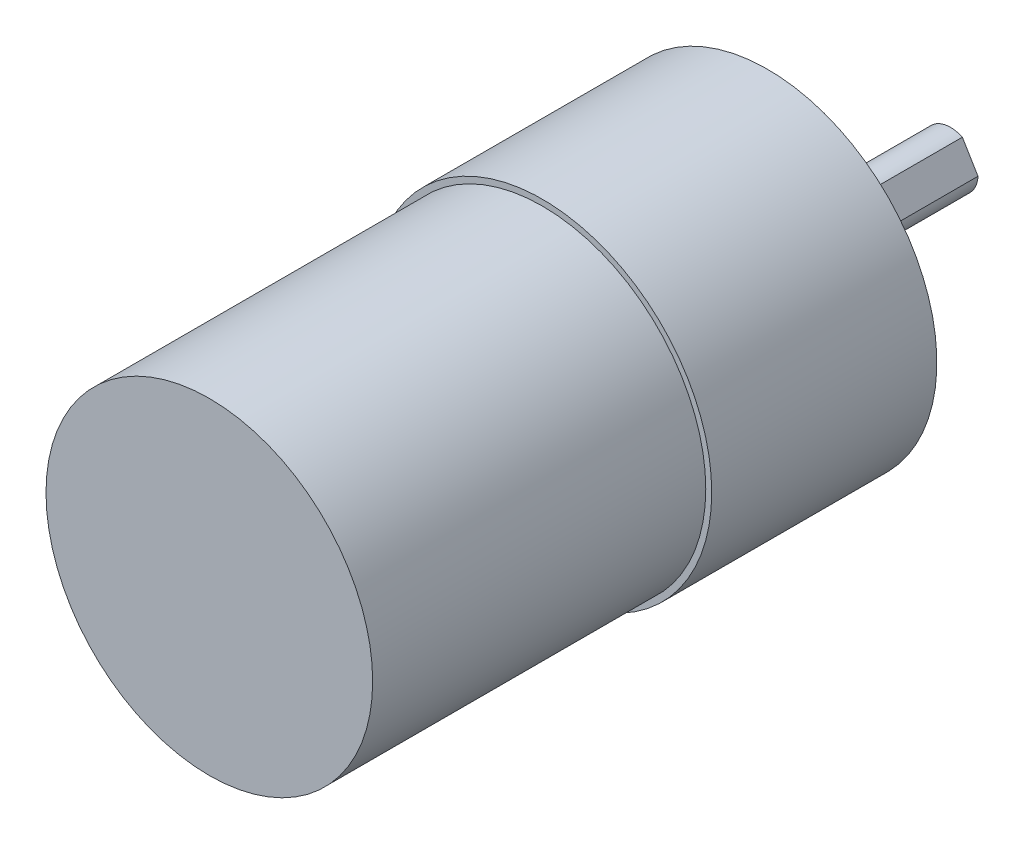
ISO-10303-21;
HEADER;
FILE_DESCRIPTION(('STEP AP214'),'2;1');
FILE_NAME('part.step','',(''),(''),'','','');
FILE_SCHEMA(('AUTOMOTIVE_DESIGN { 1 0 10303 214 1 1 1 1 }'));
ENDSEC;
DATA;
#1=APPLICATION_CONTEXT('core data for automotive mechanical design processes');
#2=APPLICATION_PROTOCOL_DEFINITION('international standard','automotive_design',2000,#1);
#3=PRODUCT_CONTEXT('',#1,'mechanical');
#4=PRODUCT('Part','Part','',(#3));
#5=PRODUCT_RELATED_PRODUCT_CATEGORY('part','',(#4));
#6=PRODUCT_DEFINITION_FORMATION('','',#4);
#7=PRODUCT_DEFINITION_CONTEXT('part definition',#1,'design');
#8=PRODUCT_DEFINITION('design','',#6,#7);
#9=PRODUCT_DEFINITION_SHAPE('','',#8);
#10=(LENGTH_UNIT() NAMED_UNIT(*) SI_UNIT(.MILLI.,.METRE.));
#11=(NAMED_UNIT(*) PLANE_ANGLE_UNIT() SI_UNIT($,.RADIAN.));
#12=(NAMED_UNIT(*) SI_UNIT($,.STERADIAN.) SOLID_ANGLE_UNIT());
#13=UNCERTAINTY_MEASURE_WITH_UNIT(LENGTH_MEASURE(1.E-05),#10,'distance_accuracy_value','');
#14=(GEOMETRIC_REPRESENTATION_CONTEXT(3) GLOBAL_UNCERTAINTY_ASSIGNED_CONTEXT((#13)) GLOBAL_UNIT_ASSIGNED_CONTEXT((#10,
#11,#12)) REPRESENTATION_CONTEXT('',''));
#15=CARTESIAN_POINT('',(0.,0.,0.));
#16=DIRECTION('',(0.,0.,1.));
#17=DIRECTION('',(1.,0.,0.));
#18=AXIS2_PLACEMENT_3D('',#15,#16,#17);
#19=CARTESIAN_POINT('',(-17.9025682367845,17.7533801681447,15.));
#20=DIRECTION('',(0.,0.,-1.));
#21=DIRECTION('',(-1.,0.,0.));
#22=AXIS2_PLACEMENT_3D('',#19,#20,#21);
#23=CYLINDRICAL_SURFACE('',#22,3.);
#24=CARTESIAN_POINT('',(-17.9025682367845,17.7533801681447,0.));
#25=DIRECTION('',(0.,0.,-1.));
#26=DIRECTION('',(-1.,0.,0.));
#27=AXIS2_PLACEMENT_3D('',#24,#25,#26);
#28=CIRCLE('',#27,3.);
#29=CARTESIAN_POINT('',(-14.9054704586056,17.6214525060152,0.));
#30=VERTEX_POINT('',#29);
#31=CARTESIAN_POINT('',(-16.615935607115,20.4634680774697,0.));
#32=VERTEX_POINT('',#31);
#33=EDGE_CURVE('E79',#30,#32,#28,.T.);
#34=ORIENTED_EDGE('',*,*,#33,.F.);
#35=DIRECTION('',(0.,0.,-1.));
#36=VECTOR('',#35,1.);
#37=CARTESIAN_POINT('',(-14.9054704586056,17.6214525060152,15.));
#38=LINE('',#37,#36);
#39=CARTESIAN_POINT('',(-14.9054704586056,17.6214525060152,15.));
#40=VERTEX_POINT('',#39);
#41=EDGE_CURVE('E60',#40,#30,#38,.T.);
#42=ORIENTED_EDGE('',*,*,#41,.F.);
#43=CARTESIAN_POINT('',(-17.9025682367845,17.7533801681447,15.));
#44=DIRECTION('',(0.,0.,-1.));
#45=DIRECTION('',(-1.,0.,0.));
#46=AXIS2_PLACEMENT_3D('',#43,#44,#45);
#47=CIRCLE('',#46,3.);
#48=CARTESIAN_POINT('',(-16.615935607115,20.4634680774697,15.));
#49=VERTEX_POINT('',#48);
#50=EDGE_CURVE('E81',#40,#49,#47,.T.);
#51=ORIENTED_EDGE('',*,*,#50,.T.);
#52=DIRECTION('',(0.,0.,-1.));
#53=VECTOR('',#52,1.);
#54=CARTESIAN_POINT('',(-16.615935607115,20.4634680774697,15.));
#55=LINE('',#54,#53);
#56=EDGE_CURVE('E72',#49,#32,#55,.T.);
#57=ORIENTED_EDGE('',*,*,#56,.T.);
#58=EDGE_LOOP('',(#34,#42,#51,#57));
#59=FACE_BOUND('',#58,.T.);
#60=ADVANCED_FACE('F43',(#59),#23,.T.);
#61=CARTESIAN_POINT('',(-17.9025682367845,17.7533801681447,0.));
#62=DIRECTION('',(0.,0.,1.));
#63=DIRECTION('',(1.,0.,0.));
#64=AXIS2_PLACEMENT_3D('',#61,#62,#63);
#65=PLANE('',#64);
#66=DIRECTION('',(0.515660344835326,-0.856793095656304,0.));
#67=VECTOR('',#66,1.);
#68=CARTESIAN_POINT('',(-3.15661417379174,-1.89980610443957,0.));
#69=LINE('',#68,#67);
#70=EDGE_CURVE('E69',#32,#30,#69,.T.);
#71=ORIENTED_EDGE('',*,*,#70,.T.);
#72=ORIENTED_EDGE('',*,*,#33,.T.);
#73=EDGE_LOOP('',(#71,#72));
#74=FACE_BOUND('',#73,.T.);
#75=ADVANCED_FACE('F83',(#74),#65,.F.);
#76=CARTESIAN_POINT('',(-17.9025682367845,17.7533801681447,81.));
#77=DIRECTION('',(0.,0.,-1.));
#78=DIRECTION('',(-1.,0.,0.));
#79=AXIS2_PLACEMENT_3D('',#76,#77,#78);
#80=CYLINDRICAL_SURFACE('',#79,18.499999957);
#81=CARTESIAN_POINT('',(-17.9025682367845,17.7533801681447,20.));
#82=DIRECTION('',(0.,0.,-1.));
#83=DIRECTION('',(-1.,0.,0.));
#84=AXIS2_PLACEMENT_3D('',#81,#82,#83);
#85=CIRCLE('',#84,18.499999957);
#86=CARTESIAN_POINT('',(-36.4025681937845,17.7533801681447,20.));
#87=VERTEX_POINT('',#86);
#88=EDGE_CURVE('E12',#87,#87,#85,.T.);
#89=ORIENTED_EDGE('',*,*,#88,.F.);
#90=EDGE_LOOP('',(#89));
#91=FACE_BOUND('',#90,.T.);
#92=CARTESIAN_POINT('',(-17.9025682367845,17.7533801681447,44.6));
#93=DIRECTION('',(0.,0.,1.));
#94=DIRECTION('',(1.,0.,0.));
#95=AXIS2_PLACEMENT_3D('',#92,#93,#94);
#96=CIRCLE('',#95,18.499999957);
#97=CARTESIAN_POINT('',(0.597431720215483,17.7533801681447,44.6));
#98=VERTEX_POINT('',#97);
#99=EDGE_CURVE('E84',#98,#98,#96,.T.);
#100=ORIENTED_EDGE('',*,*,#99,.F.);
#101=EDGE_LOOP('',(#100));
#102=FACE_BOUND('',#101,.T.);
#103=ADVANCED_FACE('F45',(#91,#102),#80,.T.);
#104=CARTESIAN_POINT('',(-17.9025682367845,17.7533801681447,20.));
#105=DIRECTION('',(0.,0.,-1.));
#106=DIRECTION('',(-1.,0.,0.));
#107=AXIS2_PLACEMENT_3D('',#104,#105,#106);
#108=CYLINDRICAL_SURFACE('',#107,5.9);
#109=CARTESIAN_POINT('',(-17.9025682367845,17.7533801681447,20.));
#110=DIRECTION('',(0.,0.,-1.));
#111=DIRECTION('',(-1.,0.,0.));
#112=AXIS2_PLACEMENT_3D('',#109,#110,#111);
#113=CIRCLE('',#112,5.9);
#114=CARTESIAN_POINT('',(-23.8025682367845,17.7533801681447,20.));
#115=VERTEX_POINT('',#114);
#116=EDGE_CURVE('E52',#115,#115,#113,.T.);
#117=ORIENTED_EDGE('',*,*,#116,.T.);
#118=EDGE_LOOP('',(#117));
#119=FACE_BOUND('',#118,.T.);
#120=CARTESIAN_POINT('',(-17.9025682367845,17.7533801681447,15.));
#121=DIRECTION('',(0.,0.,-1.));
#122=DIRECTION('',(-1.,0.,0.));
#123=AXIS2_PLACEMENT_3D('',#120,#121,#122);
#124=CIRCLE('',#123,5.9);
#125=CARTESIAN_POINT('',(-23.8025682367845,17.7533801681447,15.));
#126=VERTEX_POINT('',#125);
#127=EDGE_CURVE('E86',#126,#126,#124,.T.);
#128=ORIENTED_EDGE('',*,*,#127,.F.);
#129=EDGE_LOOP('',(#128));
#130=FACE_BOUND('',#129,.T.);
#131=ADVANCED_FACE('F123',(#119,#130),#108,.T.);
#132=CARTESIAN_POINT('',(0.,0.,20.));
#133=DIRECTION('',(0.,0.,-1.));
#134=DIRECTION('',(-1.,0.,0.));
#135=AXIS2_PLACEMENT_3D('',#132,#133,#134);
#136=PLANE('',#135);
#137=CARTESIAN_POINT('',(-19.0264465494506,2.29417910410777,20.));
#138=DIRECTION('',(0.,0.,-1.));
#139=DIRECTION('',(-1.,0.,0.));
#140=AXIS2_PLACEMENT_3D('',#137,#138,#139);
#141=CIRCLE('',#140,1.19999999997629);
#142=CARTESIAN_POINT('',(-20.2264465494269,2.29417910410777,20.));
#143=VERTEX_POINT('',#142);
#144=EDGE_CURVE('E47',#143,#143,#141,.T.);
#145=ORIENTED_EDGE('',*,*,#144,.F.);
#146=EDGE_LOOP('',(#145));
#147=FACE_BOUND('',#146,.T.);
#148=CARTESIAN_POINT('',(-31.8525682367849,10.9970868056574,20.));
#149=DIRECTION('',(0.,0.,-1.));
#150=DIRECTION('',(-1.,0.,0.));
#151=AXIS2_PLACEMENT_3D('',#148,#149,#150);
#152=CIRCLE('',#151,1.19999999997776);
#153=CARTESIAN_POINT('',(-33.0525682367627,10.9970868056574,20.));
#154=VERTEX_POINT('',#153);
#155=EDGE_CURVE('E109',#154,#154,#152,.T.);
#156=ORIENTED_EDGE('',*,*,#155,.F.);
#157=EDGE_LOOP('',(#156));
#158=FACE_BOUND('',#157,.T.);
#159=CARTESIAN_POINT('',(-30.7286899241188,26.4562878696943,20.));
#160=DIRECTION('',(0.,0.,-1.));
#161=DIRECTION('',(-1.,0.,0.));
#162=AXIS2_PLACEMENT_3D('',#159,#160,#161);
#163=CIRCLE('',#162,1.19999999997703);
#164=CARTESIAN_POINT('',(-31.9286899240959,26.4562878696943,20.));
#165=VERTEX_POINT('',#164);
#166=EDGE_CURVE('E107',#165,#165,#163,.T.);
#167=ORIENTED_EDGE('',*,*,#166,.F.);
#168=EDGE_LOOP('',(#167));
#169=FACE_BOUND('',#168,.T.);
#170=CARTESIAN_POINT('',(-16.7786899241184,33.2125812321815,20.));
#171=DIRECTION('',(0.,0.,-1.));
#172=DIRECTION('',(-1.,0.,0.));
#173=AXIS2_PLACEMENT_3D('',#170,#171,#172);
#174=CIRCLE('',#173,1.19999999997815);
#175=CARTESIAN_POINT('',(-17.9786899240966,33.2125812321815,20.));
#176=VERTEX_POINT('',#175);
#177=EDGE_CURVE('E104',#176,#176,#174,.T.);
#178=ORIENTED_EDGE('',*,*,#177,.F.);
#179=EDGE_LOOP('',(#178));
#180=FACE_BOUND('',#179,.T.);
#181=CARTESIAN_POINT('',(-5.0764465494502,9.050472466595,20.));
#182=DIRECTION('',(0.,0.,-1.));
#183=DIRECTION('',(-1.,0.,0.));
#184=AXIS2_PLACEMENT_3D('',#181,#182,#183);
#185=CIRCLE('',#184,1.19999999997626);
#186=CARTESIAN_POINT('',(-6.27644654942646,9.050472466595,20.));
#187=VERTEX_POINT('',#186);
#188=EDGE_CURVE('E100',#187,#187,#185,.T.);
#189=ORIENTED_EDGE('',*,*,#188,.F.);
#190=EDGE_LOOP('',(#189));
#191=FACE_BOUND('',#190,.T.);
#192=CARTESIAN_POINT('',(-3.95256823678412,24.5096735306319,20.));
#193=DIRECTION('',(0.,0.,-1.));
#194=DIRECTION('',(-1.,0.,0.));
#195=AXIS2_PLACEMENT_3D('',#192,#193,#194);
#196=CIRCLE('',#195,1.1999999999757);
#197=CARTESIAN_POINT('',(-5.15256823675982,24.5096735306319,20.));
#198=VERTEX_POINT('',#197);
#199=EDGE_CURVE('E97',#198,#198,#196,.T.);
#200=ORIENTED_EDGE('',*,*,#199,.F.);
#201=EDGE_LOOP('',(#200));
#202=FACE_BOUND('',#201,.T.);
#203=ORIENTED_EDGE('',*,*,#116,.F.);
#204=EDGE_LOOP('',(#203));
#205=FACE_BOUND('',#204,.T.);
#206=ORIENTED_EDGE('',*,*,#88,.T.);
#207=EDGE_LOOP('',(#206));
#208=FACE_BOUND('',#207,.T.);
#209=ADVANCED_FACE('F119',(#147,#158,#169,#180,#191,#202,#205,#208),#136,.T.);
#210=CARTESIAN_POINT('',(-17.9025682367845,17.7533801681447,15.));
#211=DIRECTION('',(0.,0.,-1.));
#212=DIRECTION('',(-1.,0.,0.));
#213=AXIS2_PLACEMENT_3D('',#210,#211,#212);
#214=PLANE('',#213);
#215=ORIENTED_EDGE('',*,*,#50,.F.);
#216=DIRECTION('',(0.515660344835326,-0.856793095656304,0.));
#217=VECTOR('',#216,1.);
#218=CARTESIAN_POINT('',(-3.15661417379174,-1.89980610443957,15.));
#219=LINE('',#218,#217);
#220=EDGE_CURVE('E66',#49,#40,#219,.T.);
#221=ORIENTED_EDGE('',*,*,#220,.F.);
#222=EDGE_LOOP('',(#215,#221));
#223=FACE_BOUND('',#222,.T.);
#224=ORIENTED_EDGE('',*,*,#127,.T.);
#225=EDGE_LOOP('',(#224));
#226=FACE_BOUND('',#225,.T.);
#227=ADVANCED_FACE('F122',(#223,#226),#214,.T.);
#228=CARTESIAN_POINT('',(-17.9025682367845,17.7533801681447,44.6));
#229=DIRECTION('',(0.,0.,1.));
#230=DIRECTION('',(1.,0.,0.));
#231=AXIS2_PLACEMENT_3D('',#228,#229,#230);
#232=PLANE('',#231);
#233=CARTESIAN_POINT('',(-17.9025682367845,17.7533801681447,44.6));
#234=DIRECTION('',(0.,0.,1.));
#235=DIRECTION('',(1.,0.,0.));
#236=AXIS2_PLACEMENT_3D('',#233,#234,#235);
#237=CIRCLE('',#236,17.849200014);
#238=CARTESIAN_POINT('',(-0.0533682227845146,17.7533801681447,44.6));
#239=VERTEX_POINT('',#238);
#240=EDGE_CURVE('E89',#239,#239,#237,.T.);
#241=ORIENTED_EDGE('',*,*,#240,.F.);
#242=EDGE_LOOP('',(#241));
#243=FACE_BOUND('',#242,.T.);
#244=ORIENTED_EDGE('',*,*,#99,.T.);
#245=EDGE_LOOP('',(#244));
#246=FACE_BOUND('',#245,.T.);
#247=ADVANCED_FACE('F142',(#243,#246),#232,.T.);
#248=CARTESIAN_POINT('',(-17.9025682367845,17.7533801681447,44.6));
#249=DIRECTION('',(0.,0.,1.));
#250=DIRECTION('',(1.,0.,0.));
#251=AXIS2_PLACEMENT_3D('',#248,#249,#250);
#252=CYLINDRICAL_SURFACE('',#251,17.849200014);
#253=ORIENTED_EDGE('',*,*,#240,.T.);
#254=EDGE_LOOP('',(#253));
#255=FACE_BOUND('',#254,.T.);
#256=CARTESIAN_POINT('',(-17.9025682367845,17.7533801681447,81.));
#257=DIRECTION('',(0.,0.,1.));
#258=DIRECTION('',(1.,0.,0.));
#259=AXIS2_PLACEMENT_3D('',#256,#257,#258);
#260=CIRCLE('',#259,17.849200014);
#261=CARTESIAN_POINT('',(-0.0533682227845146,17.7533801681447,81.));
#262=VERTEX_POINT('',#261);
#263=EDGE_CURVE('E175',#262,#262,#260,.T.);
#264=ORIENTED_EDGE('',*,*,#263,.F.);
#265=EDGE_LOOP('',(#264));
#266=FACE_BOUND('',#265,.T.);
#267=ADVANCED_FACE('F144',(#255,#266),#252,.T.);
#268=CARTESIAN_POINT('',(-17.9025682367845,17.7533801681447,81.));
#269=DIRECTION('',(0.,0.,1.));
#270=DIRECTION('',(1.,0.,0.));
#271=AXIS2_PLACEMENT_3D('',#268,#269,#270);
#272=PLANE('',#271);
#273=ORIENTED_EDGE('',*,*,#263,.T.);
#274=EDGE_LOOP('',(#273));
#275=FACE_BOUND('',#274,.T.);
#276=ADVANCED_FACE('F151',(#275),#272,.T.);
#277=CARTESIAN_POINT('',(-3.15661417379174,-1.89980610443957,15.));
#278=DIRECTION('',(0.856793095656304,0.515660344835326,0.));
#279=DIRECTION('',(-0.515660344835326,0.856793095656304,0.));
#280=AXIS2_PLACEMENT_3D('',#277,#278,#279);
#281=PLANE('',#280);
#282=ORIENTED_EDGE('',*,*,#70,.F.);
#283=ORIENTED_EDGE('',*,*,#56,.F.);
#284=ORIENTED_EDGE('',*,*,#220,.T.);
#285=ORIENTED_EDGE('',*,*,#41,.T.);
#286=EDGE_LOOP('',(#282,#283,#284,#285));
#287=FACE_BOUND('',#286,.T.);
#288=ADVANCED_FACE('F71',(#287),#281,.T.);
#289=CARTESIAN_POINT('',(-3.95256823678412,24.5096735306319,25.4));
#290=DIRECTION('',(0.,0.,-1.));
#291=DIRECTION('',(-1.,0.,0.));
#292=AXIS2_PLACEMENT_3D('',#289,#290,#291);
#293=CYLINDRICAL_SURFACE('',#292,1.1999999999757);
#294=ORIENTED_EDGE('',*,*,#199,.T.);
#295=EDGE_LOOP('',(#294));
#296=FACE_BOUND('',#295,.T.);
#297=CARTESIAN_POINT('',(-3.95256823678412,24.5096735306319,25.4));
#298=DIRECTION('',(0.,0.,-1.));
#299=DIRECTION('',(-1.,0.,0.));
#300=AXIS2_PLACEMENT_3D('',#297,#298,#299);
#301=CIRCLE('',#300,1.1999999999757);
#302=CARTESIAN_POINT('',(-5.15256823675982,24.5096735306319,25.4));
#303=VERTEX_POINT('',#302);
#304=EDGE_CURVE('E101',#303,#303,#301,.T.);
#305=ORIENTED_EDGE('',*,*,#304,.F.);
#306=EDGE_LOOP('',(#305));
#307=FACE_BOUND('',#306,.T.);
#308=ADVANCED_FACE('F171',(#296,#307),#293,.F.);
#309=CARTESIAN_POINT('',(0.,0.,25.4));
#310=DIRECTION('',(0.,0.,-1.));
#311=DIRECTION('',(-1.,0.,0.));
#312=AXIS2_PLACEMENT_3D('',#309,#310,#311);
#313=PLANE('',#312);
#314=ORIENTED_EDGE('',*,*,#304,.T.);
#315=EDGE_LOOP('',(#314));
#316=FACE_BOUND('',#315,.T.);
#317=ADVANCED_FACE('F204',(#316),#313,.T.);
#318=CARTESIAN_POINT('',(-5.0764465494502,9.050472466595,25.4));
#319=DIRECTION('',(0.,0.,-1.));
#320=DIRECTION('',(-1.,0.,0.));
#321=AXIS2_PLACEMENT_3D('',#318,#319,#320);
#322=CYLINDRICAL_SURFACE('',#321,1.19999999997626);
#323=ORIENTED_EDGE('',*,*,#188,.T.);
#324=EDGE_LOOP('',(#323));
#325=FACE_BOUND('',#324,.T.);
#326=CARTESIAN_POINT('',(-5.0764465494502,9.050472466595,25.4));
#327=DIRECTION('',(0.,0.,-1.));
#328=DIRECTION('',(-1.,0.,0.));
#329=AXIS2_PLACEMENT_3D('',#326,#327,#328);
#330=CIRCLE('',#329,1.19999999997626);
#331=CARTESIAN_POINT('',(-6.27644654942646,9.050472466595,25.4));
#332=VERTEX_POINT('',#331);
#333=EDGE_CURVE('E184',#332,#332,#330,.T.);
#334=ORIENTED_EDGE('',*,*,#333,.F.);
#335=EDGE_LOOP('',(#334));
#336=FACE_BOUND('',#335,.T.);
#337=ADVANCED_FACE('F202',(#325,#336),#322,.F.);
#338=CARTESIAN_POINT('',(0.,0.,25.4));
#339=DIRECTION('',(0.,0.,-1.));
#340=DIRECTION('',(-1.,0.,0.));
#341=AXIS2_PLACEMENT_3D('',#338,#339,#340);
#342=PLANE('',#341);
#343=ORIENTED_EDGE('',*,*,#333,.T.);
#344=EDGE_LOOP('',(#343));
#345=FACE_BOUND('',#344,.T.);
#346=ADVANCED_FACE('F200',(#345),#342,.T.);
#347=CARTESIAN_POINT('',(-16.7786899241184,33.2125812321815,25.4));
#348=DIRECTION('',(0.,0.,-1.));
#349=DIRECTION('',(-1.,0.,0.));
#350=AXIS2_PLACEMENT_3D('',#347,#348,#349);
#351=CYLINDRICAL_SURFACE('',#350,1.19999999997815);
#352=ORIENTED_EDGE('',*,*,#177,.T.);
#353=EDGE_LOOP('',(#352));
#354=FACE_BOUND('',#353,.T.);
#355=CARTESIAN_POINT('',(-16.7786899241184,33.2125812321815,25.4));
#356=DIRECTION('',(0.,0.,-1.));
#357=DIRECTION('',(-1.,0.,0.));
#358=AXIS2_PLACEMENT_3D('',#355,#356,#357);
#359=CIRCLE('',#358,1.19999999997815);
#360=CARTESIAN_POINT('',(-17.9786899240966,33.2125812321815,25.4));
#361=VERTEX_POINT('',#360);
#362=EDGE_CURVE('E194',#361,#361,#359,.T.);
#363=ORIENTED_EDGE('',*,*,#362,.F.);
#364=EDGE_LOOP('',(#363));
#365=FACE_BOUND('',#364,.T.);
#366=ADVANCED_FACE('F211',(#354,#365),#351,.F.);
#367=CARTESIAN_POINT('',(0.,0.,25.4));
#368=DIRECTION('',(0.,0.,-1.));
#369=DIRECTION('',(-1.,0.,0.));
#370=AXIS2_PLACEMENT_3D('',#367,#368,#369);
#371=PLANE('',#370);
#372=ORIENTED_EDGE('',*,*,#362,.T.);
#373=EDGE_LOOP('',(#372));
#374=FACE_BOUND('',#373,.T.);
#375=ADVANCED_FACE('F218',(#374),#371,.T.);
#376=CARTESIAN_POINT('',(-30.7286899241188,26.4562878696943,25.4));
#377=DIRECTION('',(0.,0.,-1.));
#378=DIRECTION('',(-1.,0.,0.));
#379=AXIS2_PLACEMENT_3D('',#376,#377,#378);
#380=CYLINDRICAL_SURFACE('',#379,1.19999999997703);
#381=ORIENTED_EDGE('',*,*,#166,.T.);
#382=EDGE_LOOP('',(#381));
#383=FACE_BOUND('',#382,.T.);
#384=CARTESIAN_POINT('',(-30.7286899241188,26.4562878696943,25.4));
#385=DIRECTION('',(0.,0.,-1.));
#386=DIRECTION('',(-1.,0.,0.));
#387=AXIS2_PLACEMENT_3D('',#384,#385,#386);
#388=CIRCLE('',#387,1.19999999997703);
#389=CARTESIAN_POINT('',(-31.9286899240959,26.4562878696943,25.4));
#390=VERTEX_POINT('',#389);
#391=EDGE_CURVE('E191',#390,#390,#388,.T.);
#392=ORIENTED_EDGE('',*,*,#391,.F.);
#393=EDGE_LOOP('',(#392));
#394=FACE_BOUND('',#393,.T.);
#395=ADVANCED_FACE('F222',(#383,#394),#380,.F.);
#396=CARTESIAN_POINT('',(0.,0.,25.4));
#397=DIRECTION('',(0.,0.,-1.));
#398=DIRECTION('',(-1.,0.,0.));
#399=AXIS2_PLACEMENT_3D('',#396,#397,#398);
#400=PLANE('',#399);
#401=ORIENTED_EDGE('',*,*,#391,.T.);
#402=EDGE_LOOP('',(#401));
#403=FACE_BOUND('',#402,.T.);
#404=ADVANCED_FACE('F226',(#403),#400,.T.);
#405=CARTESIAN_POINT('',(-31.8525682367849,10.9970868056574,25.4));
#406=DIRECTION('',(0.,0.,-1.));
#407=DIRECTION('',(-1.,0.,0.));
#408=AXIS2_PLACEMENT_3D('',#405,#406,#407);
#409=CYLINDRICAL_SURFACE('',#408,1.19999999997776);
#410=ORIENTED_EDGE('',*,*,#155,.T.);
#411=EDGE_LOOP('',(#410));
#412=FACE_BOUND('',#411,.T.);
#413=CARTESIAN_POINT('',(-31.8525682367849,10.9970868056574,25.4));
#414=DIRECTION('',(0.,0.,-1.));
#415=DIRECTION('',(-1.,0.,0.));
#416=AXIS2_PLACEMENT_3D('',#413,#414,#415);
#417=CIRCLE('',#416,1.19999999997776);
#418=CARTESIAN_POINT('',(-33.0525682367627,10.9970868056574,25.4));
#419=VERTEX_POINT('',#418);
#420=EDGE_CURVE('E188',#419,#419,#417,.T.);
#421=ORIENTED_EDGE('',*,*,#420,.F.);
#422=EDGE_LOOP('',(#421));
#423=FACE_BOUND('',#422,.T.);
#424=ADVANCED_FACE('F230',(#412,#423),#409,.F.);
#425=CARTESIAN_POINT('',(0.,0.,25.4));
#426=DIRECTION('',(0.,0.,-1.));
#427=DIRECTION('',(-1.,0.,0.));
#428=AXIS2_PLACEMENT_3D('',#425,#426,#427);
#429=PLANE('',#428);
#430=ORIENTED_EDGE('',*,*,#420,.T.);
#431=EDGE_LOOP('',(#430));
#432=FACE_BOUND('',#431,.T.);
#433=ADVANCED_FACE('F234',(#432),#429,.T.);
#434=CARTESIAN_POINT('',(-19.0264465494506,2.29417910410777,25.4));
#435=DIRECTION('',(0.,0.,-1.));
#436=DIRECTION('',(-1.,0.,0.));
#437=AXIS2_PLACEMENT_3D('',#434,#435,#436);
#438=CYLINDRICAL_SURFACE('',#437,1.19999999997629);
#439=ORIENTED_EDGE('',*,*,#144,.T.);
#440=EDGE_LOOP('',(#439));
#441=FACE_BOUND('',#440,.T.);
#442=CARTESIAN_POINT('',(-19.0264465494506,2.29417910410777,25.4));
#443=DIRECTION('',(0.,0.,-1.));
#444=DIRECTION('',(-1.,0.,0.));
#445=AXIS2_PLACEMENT_3D('',#442,#443,#444);
#446=CIRCLE('',#445,1.19999999997629);
#447=CARTESIAN_POINT('',(-20.2264465494269,2.29417910410777,25.4));
#448=VERTEX_POINT('',#447);
#449=EDGE_CURVE('E185',#448,#448,#446,.T.);
#450=ORIENTED_EDGE('',*,*,#449,.F.);
#451=EDGE_LOOP('',(#450));
#452=FACE_BOUND('',#451,.T.);
#453=ADVANCED_FACE('F116',(#441,#452),#438,.F.);
#454=CARTESIAN_POINT('',(0.,0.,25.4));
#455=DIRECTION('',(0.,0.,-1.));
#456=DIRECTION('',(-1.,0.,0.));
#457=AXIS2_PLACEMENT_3D('',#454,#455,#456);
#458=PLANE('',#457);
#459=ORIENTED_EDGE('',*,*,#449,.T.);
#460=EDGE_LOOP('',(#459));
#461=FACE_BOUND('',#460,.T.);
#462=ADVANCED_FACE('F240',(#461),#458,.T.);
#463=CLOSED_SHELL('',(#60,#75,#103,#131,#209,#227,#247,#267,#276,#288,#308,#317,#337,#346,#366,
#375,#395,#404,#424,#433,#453,#462));
#464=MANIFOLD_SOLID_BREP('B2',#463);
#465=ADVANCED_BREP_SHAPE_REPRESENTATION('',(#18,#464),#14);
#466=SHAPE_DEFINITION_REPRESENTATION(#9,#465);
ENDSEC;
END-ISO-10303-21;
